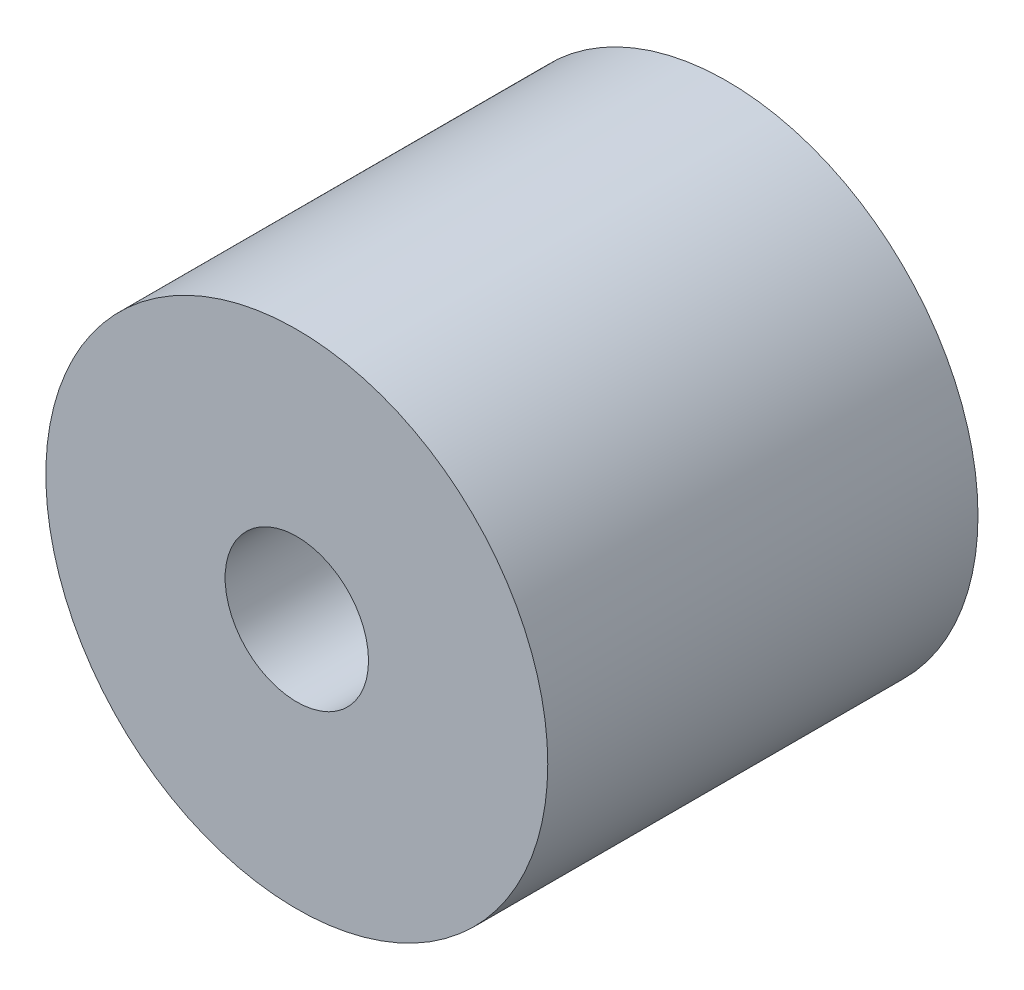
ISO-10303-21;
HEADER;
FILE_DESCRIPTION(('STEP AP214'),'2;1');
FILE_NAME('part.step','',(''),(''),'','','');
FILE_SCHEMA(('AUTOMOTIVE_DESIGN { 1 0 10303 214 1 1 1 1 }'));
ENDSEC;
DATA;
#1=APPLICATION_CONTEXT('core data for automotive mechanical design processes');
#2=APPLICATION_PROTOCOL_DEFINITION('international standard','automotive_design',2000,#1);
#3=PRODUCT_CONTEXT('',#1,'mechanical');
#4=PRODUCT('Part','Part','',(#3));
#5=PRODUCT_RELATED_PRODUCT_CATEGORY('part','',(#4));
#6=PRODUCT_DEFINITION_FORMATION('','',#4);
#7=PRODUCT_DEFINITION_CONTEXT('part definition',#1,'design');
#8=PRODUCT_DEFINITION('design','',#6,#7);
#9=PRODUCT_DEFINITION_SHAPE('','',#8);
#10=(LENGTH_UNIT() NAMED_UNIT(*) SI_UNIT(.MILLI.,.METRE.));
#11=(NAMED_UNIT(*) PLANE_ANGLE_UNIT() SI_UNIT($,.RADIAN.));
#12=(NAMED_UNIT(*) SI_UNIT($,.STERADIAN.) SOLID_ANGLE_UNIT());
#13=UNCERTAINTY_MEASURE_WITH_UNIT(LENGTH_MEASURE(1.E-05),#10,'distance_accuracy_value','');
#14=(GEOMETRIC_REPRESENTATION_CONTEXT(3) GLOBAL_UNCERTAINTY_ASSIGNED_CONTEXT((#13)) GLOBAL_UNIT_ASSIGNED_CONTEXT((#10,
#11,#12)) REPRESENTATION_CONTEXT('',''));
#15=CARTESIAN_POINT('',(0.,0.,0.));
#16=DIRECTION('',(0.,0.,1.));
#17=DIRECTION('',(1.,0.,0.));
#18=AXIS2_PLACEMENT_3D('',#15,#16,#17);
#19=CARTESIAN_POINT('',(0.,0.,30.));
#20=DIRECTION('',(0.,0.,1.));
#21=DIRECTION('',(1.,0.,0.));
#22=AXIS2_PLACEMENT_3D('',#19,#20,#21);
#23=PLANE('',#22);
#24=CARTESIAN_POINT('',(0.,0.,30.));
#25=DIRECTION('',(0.,0.,1.));
#26=DIRECTION('',(1.,0.,0.));
#27=AXIS2_PLACEMENT_3D('',#24,#25,#26);
#28=CIRCLE('',#27,17.5);
#29=CARTESIAN_POINT('',(17.5,0.,30.));
#30=VERTEX_POINT('',#29);
#31=EDGE_CURVE('E10',#30,#30,#28,.T.);
#32=ORIENTED_EDGE('',*,*,#31,.T.);
#33=EDGE_LOOP('',(#32));
#34=FACE_BOUND('',#33,.T.);
#35=CARTESIAN_POINT('',(0.,0.,30.));
#36=DIRECTION('',(0.,0.,1.));
#37=DIRECTION('',(1.,0.,0.));
#38=AXIS2_PLACEMENT_3D('',#35,#36,#37);
#39=CIRCLE('',#38,5.);
#40=CARTESIAN_POINT('',(5.,0.,30.));
#41=VERTEX_POINT('',#40);
#42=EDGE_CURVE('E41',#41,#41,#39,.T.);
#43=ORIENTED_EDGE('',*,*,#42,.F.);
#44=EDGE_LOOP('',(#43));
#45=FACE_BOUND('',#44,.T.);
#46=ADVANCED_FACE('F30',(#34,#45),#23,.T.);
#47=CARTESIAN_POINT('',(0.,0.,0.));
#48=DIRECTION('',(0.,0.,1.));
#49=DIRECTION('',(1.,0.,0.));
#50=AXIS2_PLACEMENT_3D('',#47,#48,#49);
#51=PLANE('',#50);
#52=CARTESIAN_POINT('',(0.,0.,0.));
#53=DIRECTION('',(0.,0.,1.));
#54=DIRECTION('',(1.,0.,0.));
#55=AXIS2_PLACEMENT_3D('',#52,#53,#54);
#56=CIRCLE('',#55,17.5);
#57=CARTESIAN_POINT('',(17.5,0.,0.));
#58=VERTEX_POINT('',#57);
#59=EDGE_CURVE('E34',#58,#58,#56,.T.);
#60=ORIENTED_EDGE('',*,*,#59,.F.);
#61=EDGE_LOOP('',(#60));
#62=FACE_BOUND('',#61,.T.);
#63=CARTESIAN_POINT('',(0.,0.,0.));
#64=DIRECTION('',(0.,0.,1.));
#65=DIRECTION('',(1.,0.,0.));
#66=AXIS2_PLACEMENT_3D('',#63,#64,#65);
#67=CIRCLE('',#66,5.);
#68=CARTESIAN_POINT('',(5.,0.,0.));
#69=VERTEX_POINT('',#68);
#70=EDGE_CURVE('E43',#69,#69,#67,.T.);
#71=ORIENTED_EDGE('',*,*,#70,.T.);
#72=EDGE_LOOP('',(#71));
#73=FACE_BOUND('',#72,.T.);
#74=ADVANCED_FACE('F53',(#62,#73),#51,.F.);
#75=CARTESIAN_POINT('',(0.,0.,30.));
#76=DIRECTION('',(0.,0.,-1.));
#77=DIRECTION('',(-1.,0.,0.));
#78=AXIS2_PLACEMENT_3D('',#75,#76,#77);
#79=CYLINDRICAL_SURFACE('',#78,17.5);
#80=ORIENTED_EDGE('',*,*,#31,.F.);
#81=EDGE_LOOP('',(#80));
#82=FACE_BOUND('',#81,.T.);
#83=ORIENTED_EDGE('',*,*,#59,.T.);
#84=EDGE_LOOP('',(#83));
#85=FACE_BOUND('',#84,.T.);
#86=ADVANCED_FACE('F32',(#82,#85),#79,.T.);
#87=CARTESIAN_POINT('',(0.,0.,30.));
#88=DIRECTION('',(0.,0.,-1.));
#89=DIRECTION('',(-1.,0.,0.));
#90=AXIS2_PLACEMENT_3D('',#87,#88,#89);
#91=CYLINDRICAL_SURFACE('',#90,5.);
#92=ORIENTED_EDGE('',*,*,#42,.T.);
#93=EDGE_LOOP('',(#92));
#94=FACE_BOUND('',#93,.T.);
#95=ORIENTED_EDGE('',*,*,#70,.F.);
#96=EDGE_LOOP('',(#95));
#97=FACE_BOUND('',#96,.T.);
#98=ADVANCED_FACE('F49',(#94,#97),#91,.F.);
#99=CLOSED_SHELL('',(#46,#74,#86,#98));
#100=MANIFOLD_SOLID_BREP('B2',#99);
#101=ADVANCED_BREP_SHAPE_REPRESENTATION('',(#18,#100),#14);
#102=SHAPE_DEFINITION_REPRESENTATION(#9,#101);
ENDSEC;
END-ISO-10303-21;
